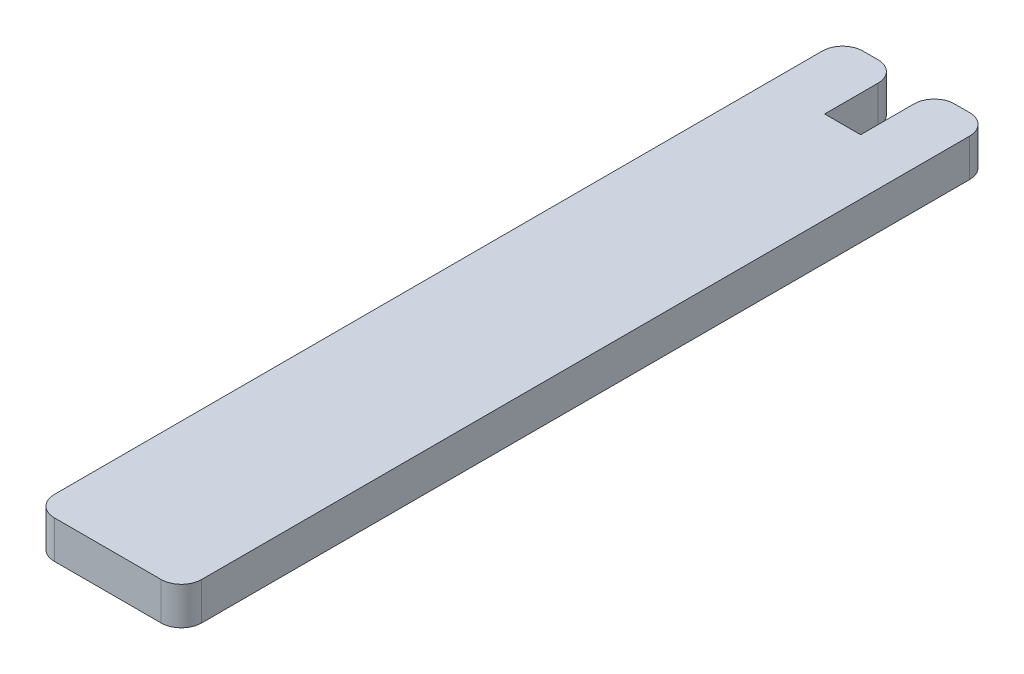
ISO-10303-21;
HEADER;
FILE_DESCRIPTION(('STEP AP214'),'2;1');
FILE_NAME('part.step','',(''),(''),'','','');
FILE_SCHEMA(('AUTOMOTIVE_DESIGN { 1 0 10303 214 1 1 1 1 }'));
ENDSEC;
DATA;
#1=APPLICATION_CONTEXT('core data for automotive mechanical design processes');
#2=APPLICATION_PROTOCOL_DEFINITION('international standard','automotive_design',2000,#1);
#3=PRODUCT_CONTEXT('',#1,'mechanical');
#4=PRODUCT('Part','Part','',(#3));
#5=PRODUCT_RELATED_PRODUCT_CATEGORY('part','',(#4));
#6=PRODUCT_DEFINITION_FORMATION('','',#4);
#7=PRODUCT_DEFINITION_CONTEXT('part definition',#1,'design');
#8=PRODUCT_DEFINITION('design','',#6,#7);
#9=PRODUCT_DEFINITION_SHAPE('','',#8);
#10=(LENGTH_UNIT() NAMED_UNIT(*) SI_UNIT(.MILLI.,.METRE.));
#11=(NAMED_UNIT(*) PLANE_ANGLE_UNIT() SI_UNIT($,.RADIAN.));
#12=(NAMED_UNIT(*) SI_UNIT($,.STERADIAN.) SOLID_ANGLE_UNIT());
#13=UNCERTAINTY_MEASURE_WITH_UNIT(LENGTH_MEASURE(1.E-05),#10,'distance_accuracy_value','');
#14=(GEOMETRIC_REPRESENTATION_CONTEXT(3) GLOBAL_UNCERTAINTY_ASSIGNED_CONTEXT((#13)) GLOBAL_UNIT_ASSIGNED_CONTEXT((#10,
#11,#12)) REPRESENTATION_CONTEXT('',''));
#15=CARTESIAN_POINT('',(0.,0.,0.));
#16=DIRECTION('',(0.,0.,1.));
#17=DIRECTION('',(1.,0.,0.));
#18=AXIS2_PLACEMENT_3D('',#15,#16,#17);
#19=CARTESIAN_POINT('',(12.7,6.5,-69.7));
#20=DIRECTION('',(-1.,0.,0.));
#21=DIRECTION('',(0.,0.,1.));
#22=AXIS2_PLACEMENT_3D('',#19,#20,#21);
#23=PLANE('',#22);
#24=DIRECTION('',(0.,0.,-1.));
#25=VECTOR('',#24,1.);
#26=CARTESIAN_POINT('',(12.7,6.5,-69.7));
#27=LINE('',#26,#25);
#28=CARTESIAN_POINT('',(12.7,6.5,66.2));
#29=VERTEX_POINT('',#28);
#30=CARTESIAN_POINT('',(12.7,6.5,-66.2));
#31=VERTEX_POINT('',#30);
#32=EDGE_CURVE('E193',#29,#31,#27,.T.);
#33=ORIENTED_EDGE('',*,*,#32,.F.);
#34=DIRECTION('',(0.,-1.,0.));
#35=VECTOR('',#34,1.);
#36=CARTESIAN_POINT('',(12.7,6.5,66.2));
#37=LINE('',#36,#35);
#38=CARTESIAN_POINT('',(12.7,0.,66.2));
#39=VERTEX_POINT('',#38);
#40=EDGE_CURVE('E196',#29,#39,#37,.T.);
#41=ORIENTED_EDGE('',*,*,#40,.T.);
#42=DIRECTION('',(0.,0.,-1.));
#43=VECTOR('',#42,1.);
#44=CARTESIAN_POINT('',(12.7,0.,-69.7));
#45=LINE('',#44,#43);
#46=CARTESIAN_POINT('',(12.7,0.,-66.2));
#47=VERTEX_POINT('',#46);
#48=EDGE_CURVE('E173',#39,#47,#45,.T.);
#49=ORIENTED_EDGE('',*,*,#48,.T.);
#50=DIRECTION('',(0.,-1.,0.));
#51=VECTOR('',#50,1.);
#52=CARTESIAN_POINT('',(12.7,6.5,-66.2));
#53=LINE('',#52,#51);
#54=EDGE_CURVE('E156',#47,#31,#53,.F.);
#55=ORIENTED_EDGE('',*,*,#54,.T.);
#56=EDGE_LOOP('',(#33,#41,#49,#55));
#57=FACE_BOUND('',#56,.T.);
#58=ADVANCED_FACE('F33',(#57),#23,.F.);
#59=CARTESIAN_POINT('',(3.1,6.5,-69.7));
#60=DIRECTION('',(0.,0.,1.));
#61=DIRECTION('',(1.,0.,0.));
#62=AXIS2_PLACEMENT_3D('',#59,#60,#61);
#63=PLANE('',#62);
#64=DIRECTION('',(-1.,0.,0.));
#65=VECTOR('',#64,1.);
#66=CARTESIAN_POINT('',(3.1,0.,-69.7));
#67=LINE('',#66,#65);
#68=CARTESIAN_POINT('',(9.19999999999999,0.,-69.7));
#69=VERTEX_POINT('',#68);
#70=CARTESIAN_POINT('',(6.6,0.,-69.7));
#71=VERTEX_POINT('',#70);
#72=EDGE_CURVE('E176',#69,#71,#67,.T.);
#73=ORIENTED_EDGE('',*,*,#72,.T.);
#74=DIRECTION('',(0.,-1.,0.));
#75=VECTOR('',#74,1.);
#76=CARTESIAN_POINT('',(6.6,6.5,-69.7));
#77=LINE('',#76,#75);
#78=CARTESIAN_POINT('',(6.6,6.5,-69.7));
#79=VERTEX_POINT('',#78);
#80=EDGE_CURVE('E235',#71,#79,#77,.F.);
#81=ORIENTED_EDGE('',*,*,#80,.T.);
#82=DIRECTION('',(-1.,0.,0.));
#83=VECTOR('',#82,1.);
#84=CARTESIAN_POINT('',(3.1,6.5,-69.7));
#85=LINE('',#84,#83);
#86=CARTESIAN_POINT('',(9.19999999999999,6.5,-69.7));
#87=VERTEX_POINT('',#86);
#88=EDGE_CURVE('E147',#87,#79,#85,.T.);
#89=ORIENTED_EDGE('',*,*,#88,.F.);
#90=DIRECTION('',(0.,-1.,0.));
#91=VECTOR('',#90,1.);
#92=CARTESIAN_POINT('',(9.19999999999999,6.5,-69.7));
#93=LINE('',#92,#91);
#94=EDGE_CURVE('E232',#87,#69,#93,.T.);
#95=ORIENTED_EDGE('',*,*,#94,.T.);
#96=EDGE_LOOP('',(#73,#81,#89,#95));
#97=FACE_BOUND('',#96,.T.);
#98=ADVANCED_FACE('F294',(#97),#63,.F.);
#99=CARTESIAN_POINT('',(3.1,6.5,-69.7));
#100=DIRECTION('',(1.,0.,0.));
#101=DIRECTION('',(0.,0.,-1.));
#102=AXIS2_PLACEMENT_3D('',#99,#100,#101);
#103=PLANE('',#102);
#104=DIRECTION('',(0.,0.,1.));
#105=VECTOR('',#104,1.);
#106=CARTESIAN_POINT('',(3.1,6.5,-69.7));
#107=LINE('',#106,#105);
#108=CARTESIAN_POINT('',(3.1,6.5,-66.2));
#109=VERTEX_POINT('',#108);
#110=CARTESIAN_POINT('',(3.1,6.5,-57.));
#111=VERTEX_POINT('',#110);
#112=EDGE_CURVE('E133',#109,#111,#107,.T.);
#113=ORIENTED_EDGE('',*,*,#112,.F.);
#114=DIRECTION('',(0.,-1.,0.));
#115=VECTOR('',#114,1.);
#116=CARTESIAN_POINT('',(3.1,6.5,-66.2));
#117=LINE('',#116,#115);
#118=CARTESIAN_POINT('',(3.1,0.,-66.2));
#119=VERTEX_POINT('',#118);
#120=EDGE_CURVE('E230',#109,#119,#117,.T.);
#121=ORIENTED_EDGE('',*,*,#120,.T.);
#122=DIRECTION('',(0.,0.,1.));
#123=VECTOR('',#122,1.);
#124=CARTESIAN_POINT('',(3.1,0.,-69.7));
#125=LINE('',#124,#123);
#126=CARTESIAN_POINT('',(3.1,0.,-57.));
#127=VERTEX_POINT('',#126);
#128=EDGE_CURVE('E153',#119,#127,#125,.T.);
#129=ORIENTED_EDGE('',*,*,#128,.T.);
#130=DIRECTION('',(0.,-1.,0.));
#131=VECTOR('',#130,1.);
#132=CARTESIAN_POINT('',(3.1,6.5,-57.));
#133=LINE('',#132,#131);
#134=EDGE_CURVE('E150',#111,#127,#133,.T.);
#135=ORIENTED_EDGE('',*,*,#134,.F.);
#136=EDGE_LOOP('',(#113,#121,#129,#135));
#137=FACE_BOUND('',#136,.T.);
#138=ADVANCED_FACE('F151',(#137),#103,.F.);
#139=CARTESIAN_POINT('',(-3.1,6.5,-57.));
#140=DIRECTION('',(0.,0.,1.));
#141=DIRECTION('',(1.,0.,0.));
#142=AXIS2_PLACEMENT_3D('',#139,#140,#141);
#143=PLANE('',#142);
#144=DIRECTION('',(-1.,0.,0.));
#145=VECTOR('',#144,1.);
#146=CARTESIAN_POINT('',(-3.1,0.,-57.));
#147=LINE('',#146,#145);
#148=CARTESIAN_POINT('',(-3.1,0.,-57.));
#149=VERTEX_POINT('',#148);
#150=EDGE_CURVE('E180',#127,#149,#147,.T.);
#151=ORIENTED_EDGE('',*,*,#150,.T.);
#152=DIRECTION('',(0.,-1.,0.));
#153=VECTOR('',#152,1.);
#154=CARTESIAN_POINT('',(-3.1,6.5,-57.));
#155=LINE('',#154,#153);
#156=CARTESIAN_POINT('',(-3.1,6.5,-57.));
#157=VERTEX_POINT('',#156);
#158=EDGE_CURVE('E157',#157,#149,#155,.T.);
#159=ORIENTED_EDGE('',*,*,#158,.F.);
#160=DIRECTION('',(-1.,0.,0.));
#161=VECTOR('',#160,1.);
#162=CARTESIAN_POINT('',(-3.1,6.5,-57.));
#163=LINE('',#162,#161);
#164=EDGE_CURVE('E139',#111,#157,#163,.T.);
#165=ORIENTED_EDGE('',*,*,#164,.F.);
#166=ORIENTED_EDGE('',*,*,#134,.T.);
#167=EDGE_LOOP('',(#151,#159,#165,#166));
#168=FACE_BOUND('',#167,.T.);
#169=ADVANCED_FACE('F159',(#168),#143,.F.);
#170=CARTESIAN_POINT('',(-3.1,6.5,-69.7));
#171=DIRECTION('',(-1.,0.,0.));
#172=DIRECTION('',(0.,0.,1.));
#173=AXIS2_PLACEMENT_3D('',#170,#171,#172);
#174=PLANE('',#173);
#175=DIRECTION('',(0.,0.,-1.));
#176=VECTOR('',#175,1.);
#177=CARTESIAN_POINT('',(-3.1,0.,-69.7));
#178=LINE('',#177,#176);
#179=CARTESIAN_POINT('',(-3.1,0.,-66.2));
#180=VERTEX_POINT('',#179);
#181=EDGE_CURVE('E182',#149,#180,#178,.T.);
#182=ORIENTED_EDGE('',*,*,#181,.T.);
#183=DIRECTION('',(0.,-1.,0.));
#184=VECTOR('',#183,1.);
#185=CARTESIAN_POINT('',(-3.1,6.5,-66.2));
#186=LINE('',#185,#184);
#187=CARTESIAN_POINT('',(-3.1,6.5,-66.2));
#188=VERTEX_POINT('',#187);
#189=EDGE_CURVE('E11',#180,#188,#186,.F.);
#190=ORIENTED_EDGE('',*,*,#189,.T.);
#191=DIRECTION('',(0.,0.,-1.));
#192=VECTOR('',#191,1.);
#193=CARTESIAN_POINT('',(-3.1,6.5,-69.7));
#194=LINE('',#193,#192);
#195=EDGE_CURVE('E162',#157,#188,#194,.T.);
#196=ORIENTED_EDGE('',*,*,#195,.F.);
#197=ORIENTED_EDGE('',*,*,#158,.T.);
#198=EDGE_LOOP('',(#182,#190,#196,#197));
#199=FACE_BOUND('',#198,.T.);
#200=ADVANCED_FACE('F283',(#199),#174,.F.);
#201=CARTESIAN_POINT('',(-12.7,6.5,-69.7));
#202=DIRECTION('',(0.,0.,1.));
#203=DIRECTION('',(1.,0.,0.));
#204=AXIS2_PLACEMENT_3D('',#201,#202,#203);
#205=PLANE('',#204);
#206=DIRECTION('',(-1.,0.,0.));
#207=VECTOR('',#206,1.);
#208=CARTESIAN_POINT('',(-12.7,6.5,-69.7));
#209=LINE('',#208,#207);
#210=CARTESIAN_POINT('',(-6.6,6.5,-69.7));
#211=VERTEX_POINT('',#210);
#212=CARTESIAN_POINT('',(-9.20000000000001,6.5,-69.7));
#213=VERTEX_POINT('',#212);
#214=EDGE_CURVE('E164',#211,#213,#209,.T.);
#215=ORIENTED_EDGE('',*,*,#214,.F.);
#216=DIRECTION('',(0.,-1.,0.));
#217=VECTOR('',#216,1.);
#218=CARTESIAN_POINT('',(-6.6,6.5,-69.7));
#219=LINE('',#218,#217);
#220=CARTESIAN_POINT('',(-6.6,0.,-69.7));
#221=VERTEX_POINT('',#220);
#222=EDGE_CURVE('E41',#211,#221,#219,.T.);
#223=ORIENTED_EDGE('',*,*,#222,.T.);
#224=DIRECTION('',(-1.,0.,0.));
#225=VECTOR('',#224,1.);
#226=CARTESIAN_POINT('',(-12.7,0.,-69.7));
#227=LINE('',#226,#225);
#228=CARTESIAN_POINT('',(-9.20000000000001,0.,-69.7));
#229=VERTEX_POINT('',#228);
#230=EDGE_CURVE('E185',#221,#229,#227,.T.);
#231=ORIENTED_EDGE('',*,*,#230,.T.);
#232=DIRECTION('',(0.,-1.,0.));
#233=VECTOR('',#232,1.);
#234=CARTESIAN_POINT('',(-9.20000000000001,6.5,-69.7));
#235=LINE('',#234,#233);
#236=EDGE_CURVE('E237',#229,#213,#235,.F.);
#237=ORIENTED_EDGE('',*,*,#236,.T.);
#238=EDGE_LOOP('',(#215,#223,#231,#237));
#239=FACE_BOUND('',#238,.T.);
#240=ADVANCED_FACE('F243',(#239),#205,.F.);
#241=CARTESIAN_POINT('',(-12.7,6.5,-69.7));
#242=DIRECTION('',(1.,0.,0.));
#243=DIRECTION('',(0.,0.,-1.));
#244=AXIS2_PLACEMENT_3D('',#241,#242,#243);
#245=PLANE('',#244);
#246=DIRECTION('',(0.,0.,1.));
#247=VECTOR('',#246,1.);
#248=CARTESIAN_POINT('',(-12.7,0.,-69.7));
#249=LINE('',#248,#247);
#250=CARTESIAN_POINT('',(-12.7,0.,-66.2));
#251=VERTEX_POINT('',#250);
#252=CARTESIAN_POINT('',(-12.7,0.,66.2));
#253=VERTEX_POINT('',#252);
#254=EDGE_CURVE('E188',#251,#253,#249,.T.);
#255=ORIENTED_EDGE('',*,*,#254,.T.);
#256=DIRECTION('',(0.,-1.,0.));
#257=VECTOR('',#256,1.);
#258=CARTESIAN_POINT('',(-12.7,6.5,66.2));
#259=LINE('',#258,#257);
#260=CARTESIAN_POINT('',(-12.7,6.5,66.2));
#261=VERTEX_POINT('',#260);
#262=EDGE_CURVE('E48',#253,#261,#259,.F.);
#263=ORIENTED_EDGE('',*,*,#262,.T.);
#264=DIRECTION('',(0.,0.,1.));
#265=VECTOR('',#264,1.);
#266=CARTESIAN_POINT('',(-12.7,6.5,-69.7));
#267=LINE('',#266,#265);
#268=CARTESIAN_POINT('',(-12.7,6.5,-66.2));
#269=VERTEX_POINT('',#268);
#270=EDGE_CURVE('E169',#269,#261,#267,.T.);
#271=ORIENTED_EDGE('',*,*,#270,.F.);
#272=DIRECTION('',(0.,-1.,0.));
#273=VECTOR('',#272,1.);
#274=CARTESIAN_POINT('',(-12.7,6.5,-66.2));
#275=LINE('',#274,#273);
#276=EDGE_CURVE('E226',#269,#251,#275,.T.);
#277=ORIENTED_EDGE('',*,*,#276,.T.);
#278=EDGE_LOOP('',(#255,#263,#271,#277));
#279=FACE_BOUND('',#278,.T.);
#280=ADVANCED_FACE('F255',(#279),#245,.F.);
#281=CARTESIAN_POINT('',(-12.7,6.5,69.7));
#282=DIRECTION('',(0.,0.,-1.));
#283=DIRECTION('',(-1.,0.,0.));
#284=AXIS2_PLACEMENT_3D('',#281,#282,#283);
#285=PLANE('',#284);
#286=DIRECTION('',(1.,0.,0.));
#287=VECTOR('',#286,1.);
#288=CARTESIAN_POINT('',(-12.7,0.,69.7));
#289=LINE('',#288,#287);
#290=CARTESIAN_POINT('',(-9.19999999999999,0.,69.7));
#291=VERTEX_POINT('',#290);
#292=CARTESIAN_POINT('',(9.2,0.,69.7));
#293=VERTEX_POINT('',#292);
#294=EDGE_CURVE('E190',#291,#293,#289,.T.);
#295=ORIENTED_EDGE('',*,*,#294,.T.);
#296=DIRECTION('',(0.,-1.,0.));
#297=VECTOR('',#296,1.);
#298=CARTESIAN_POINT('',(9.20000000000001,6.5,69.7));
#299=LINE('',#298,#297);
#300=CARTESIAN_POINT('',(9.2,6.5,69.7));
#301=VERTEX_POINT('',#300);
#302=EDGE_CURVE('E214',#293,#301,#299,.F.);
#303=ORIENTED_EDGE('',*,*,#302,.T.);
#304=DIRECTION('',(1.,0.,0.));
#305=VECTOR('',#304,1.);
#306=CARTESIAN_POINT('',(-12.7,6.5,69.7));
#307=LINE('',#306,#305);
#308=CARTESIAN_POINT('',(-9.19999999999999,6.5,69.7));
#309=VERTEX_POINT('',#308);
#310=EDGE_CURVE('E171',#309,#301,#307,.T.);
#311=ORIENTED_EDGE('',*,*,#310,.F.);
#312=DIRECTION('',(0.,-1.,0.));
#313=VECTOR('',#312,1.);
#314=CARTESIAN_POINT('',(-9.19999999999999,6.5,69.7));
#315=LINE('',#314,#313);
#316=EDGE_CURVE('E211',#309,#291,#315,.T.);
#317=ORIENTED_EDGE('',*,*,#316,.T.);
#318=EDGE_LOOP('',(#295,#303,#311,#317));
#319=FACE_BOUND('',#318,.T.);
#320=ADVANCED_FACE('F263',(#319),#285,.F.);
#321=CARTESIAN_POINT('',(0.,6.5,0.));
#322=DIRECTION('',(0.,1.,0.));
#323=DIRECTION('',(0.,0.,1.));
#324=AXIS2_PLACEMENT_3D('',#321,#322,#323);
#325=PLANE('',#324);
#326=ORIENTED_EDGE('',*,*,#310,.T.);
#327=CARTESIAN_POINT('',(9.20000000000001,6.5,66.2));
#328=DIRECTION('',(0.,1.,0.));
#329=DIRECTION('',(0.,0.,1.));
#330=AXIS2_PLACEMENT_3D('',#327,#328,#329);
#331=CIRCLE('',#330,3.5);
#332=EDGE_CURVE('E224',#301,#29,#331,.T.);
#333=ORIENTED_EDGE('',*,*,#332,.T.);
#334=ORIENTED_EDGE('',*,*,#32,.T.);
#335=CARTESIAN_POINT('',(9.19999999999999,6.5,-66.2));
#336=DIRECTION('',(0.,1.,0.));
#337=DIRECTION('',(0.,0.,1.));
#338=AXIS2_PLACEMENT_3D('',#335,#336,#337);
#339=CIRCLE('',#338,3.5);
#340=EDGE_CURVE('E216',#31,#87,#339,.T.);
#341=ORIENTED_EDGE('',*,*,#340,.T.);
#342=ORIENTED_EDGE('',*,*,#88,.T.);
#343=CARTESIAN_POINT('',(6.6,6.5,-66.2));
#344=DIRECTION('',(0.,1.,0.));
#345=DIRECTION('',(0.,0.,1.));
#346=AXIS2_PLACEMENT_3D('',#343,#344,#345);
#347=CIRCLE('',#346,3.5);
#348=EDGE_CURVE('E143',#79,#109,#347,.T.);
#349=ORIENTED_EDGE('',*,*,#348,.T.);
#350=ORIENTED_EDGE('',*,*,#112,.T.);
#351=ORIENTED_EDGE('',*,*,#164,.T.);
#352=ORIENTED_EDGE('',*,*,#195,.T.);
#353=CARTESIAN_POINT('',(-6.6,6.5,-66.2));
#354=DIRECTION('',(0.,1.,0.));
#355=DIRECTION('',(0.,0.,1.));
#356=AXIS2_PLACEMENT_3D('',#353,#354,#355);
#357=CIRCLE('',#356,3.5);
#358=EDGE_CURVE('E219',#188,#211,#357,.T.);
#359=ORIENTED_EDGE('',*,*,#358,.T.);
#360=ORIENTED_EDGE('',*,*,#214,.T.);
#361=CARTESIAN_POINT('',(-9.20000000000001,6.5,-66.2));
#362=DIRECTION('',(0.,1.,0.));
#363=DIRECTION('',(0.,0.,1.));
#364=AXIS2_PLACEMENT_3D('',#361,#362,#363);
#365=CIRCLE('',#364,3.5);
#366=EDGE_CURVE('E55',#213,#269,#365,.T.);
#367=ORIENTED_EDGE('',*,*,#366,.T.);
#368=ORIENTED_EDGE('',*,*,#270,.T.);
#369=CARTESIAN_POINT('',(-9.19999999999999,6.5,66.2));
#370=DIRECTION('',(0.,1.,0.));
#371=DIRECTION('',(0.,0.,1.));
#372=AXIS2_PLACEMENT_3D('',#369,#370,#371);
#373=CIRCLE('',#372,3.5);
#374=EDGE_CURVE('E222',#261,#309,#373,.T.);
#375=ORIENTED_EDGE('',*,*,#374,.T.);
#376=EDGE_LOOP('',(#326,#333,#334,#341,#342,#349,#350,#351,#352,#359,#360,#367,#368,#375));
#377=FACE_BOUND('',#376,.T.);
#378=ADVANCED_FACE('F136',(#377),#325,.T.);
#379=CARTESIAN_POINT('',(0.,0.,0.));
#380=DIRECTION('',(0.,1.,0.));
#381=DIRECTION('',(0.,0.,1.));
#382=AXIS2_PLACEMENT_3D('',#379,#380,#381);
#383=PLANE('',#382);
#384=ORIENTED_EDGE('',*,*,#48,.F.);
#385=CARTESIAN_POINT('',(9.20000000000001,0.,66.2));
#386=DIRECTION('',(0.,1.,0.));
#387=DIRECTION('',(0.,0.,1.));
#388=AXIS2_PLACEMENT_3D('',#385,#386,#387);
#389=CIRCLE('',#388,3.5);
#390=EDGE_CURVE('E209',#39,#293,#389,.F.);
#391=ORIENTED_EDGE('',*,*,#390,.T.);
#392=ORIENTED_EDGE('',*,*,#294,.F.);
#393=CARTESIAN_POINT('',(-9.19999999999999,0.,66.2));
#394=DIRECTION('',(0.,1.,0.));
#395=DIRECTION('',(0.,0.,1.));
#396=AXIS2_PLACEMENT_3D('',#393,#394,#395);
#397=CIRCLE('',#396,3.5);
#398=EDGE_CURVE('E207',#291,#253,#397,.F.);
#399=ORIENTED_EDGE('',*,*,#398,.T.);
#400=ORIENTED_EDGE('',*,*,#254,.F.);
#401=CARTESIAN_POINT('',(-9.20000000000001,0.,-66.2));
#402=DIRECTION('',(0.,1.,0.));
#403=DIRECTION('',(0.,0.,1.));
#404=AXIS2_PLACEMENT_3D('',#401,#402,#403);
#405=CIRCLE('',#404,3.5);
#406=EDGE_CURVE('E201',#251,#229,#405,.F.);
#407=ORIENTED_EDGE('',*,*,#406,.T.);
#408=ORIENTED_EDGE('',*,*,#230,.F.);
#409=CARTESIAN_POINT('',(-6.6,0.,-66.2));
#410=DIRECTION('',(0.,1.,0.));
#411=DIRECTION('',(0.,0.,1.));
#412=AXIS2_PLACEMENT_3D('',#409,#410,#411);
#413=CIRCLE('',#412,3.5);
#414=EDGE_CURVE('E203',#221,#180,#413,.F.);
#415=ORIENTED_EDGE('',*,*,#414,.T.);
#416=ORIENTED_EDGE('',*,*,#181,.F.);
#417=ORIENTED_EDGE('',*,*,#150,.F.);
#418=ORIENTED_EDGE('',*,*,#128,.F.);
#419=CARTESIAN_POINT('',(6.6,0.,-66.2));
#420=DIRECTION('',(0.,1.,0.));
#421=DIRECTION('',(0.,0.,1.));
#422=AXIS2_PLACEMENT_3D('',#419,#420,#421);
#423=CIRCLE('',#422,3.5);
#424=EDGE_CURVE('E205',#119,#71,#423,.F.);
#425=ORIENTED_EDGE('',*,*,#424,.T.);
#426=ORIENTED_EDGE('',*,*,#72,.F.);
#427=CARTESIAN_POINT('',(9.19999999999999,0.,-66.2));
#428=DIRECTION('',(0.,1.,0.));
#429=DIRECTION('',(0.,0.,1.));
#430=AXIS2_PLACEMENT_3D('',#427,#428,#429);
#431=CIRCLE('',#430,3.5);
#432=EDGE_CURVE('E199',#69,#47,#431,.F.);
#433=ORIENTED_EDGE('',*,*,#432,.T.);
#434=EDGE_LOOP('',(#384,#391,#392,#399,#400,#407,#408,#415,#416,#417,#418,#425,#426,#433));
#435=FACE_BOUND('',#434,.T.);
#436=ADVANCED_FACE('F249',(#435),#383,.F.);
#437=CARTESIAN_POINT('',(9.20000000000001,6.5,66.2));
#438=DIRECTION('',(0.,-1.,0.));
#439=DIRECTION('',(0.,0.,-1.));
#440=AXIS2_PLACEMENT_3D('',#437,#438,#439);
#441=CYLINDRICAL_SURFACE('',#440,3.5);
#442=ORIENTED_EDGE('',*,*,#332,.F.);
#443=ORIENTED_EDGE('',*,*,#302,.F.);
#444=ORIENTED_EDGE('',*,*,#390,.F.);
#445=ORIENTED_EDGE('',*,*,#40,.F.);
#446=EDGE_LOOP('',(#442,#443,#444,#445));
#447=FACE_BOUND('',#446,.T.);
#448=ADVANCED_FACE('F268',(#447),#441,.T.);
#449=CARTESIAN_POINT('',(-9.19999999999999,6.5,66.2));
#450=DIRECTION('',(0.,-1.,0.));
#451=DIRECTION('',(0.,0.,-1.));
#452=AXIS2_PLACEMENT_3D('',#449,#450,#451);
#453=CYLINDRICAL_SURFACE('',#452,3.5);
#454=ORIENTED_EDGE('',*,*,#374,.F.);
#455=ORIENTED_EDGE('',*,*,#262,.F.);
#456=ORIENTED_EDGE('',*,*,#398,.F.);
#457=ORIENTED_EDGE('',*,*,#316,.F.);
#458=EDGE_LOOP('',(#454,#455,#456,#457));
#459=FACE_BOUND('',#458,.T.);
#460=ADVANCED_FACE('F260',(#459),#453,.T.);
#461=CARTESIAN_POINT('',(6.6,6.5,-66.2));
#462=DIRECTION('',(0.,-1.,0.));
#463=DIRECTION('',(0.,0.,-1.));
#464=AXIS2_PLACEMENT_3D('',#461,#462,#463);
#465=CYLINDRICAL_SURFACE('',#464,3.5);
#466=ORIENTED_EDGE('',*,*,#348,.F.);
#467=ORIENTED_EDGE('',*,*,#80,.F.);
#468=ORIENTED_EDGE('',*,*,#424,.F.);
#469=ORIENTED_EDGE('',*,*,#120,.F.);
#470=EDGE_LOOP('',(#466,#467,#468,#469));
#471=FACE_BOUND('',#470,.T.);
#472=ADVANCED_FACE('F280',(#471),#465,.T.);
#473=CARTESIAN_POINT('',(-6.6,6.5,-66.2));
#474=DIRECTION('',(0.,-1.,0.));
#475=DIRECTION('',(0.,0.,-1.));
#476=AXIS2_PLACEMENT_3D('',#473,#474,#475);
#477=CYLINDRICAL_SURFACE('',#476,3.5);
#478=ORIENTED_EDGE('',*,*,#358,.F.);
#479=ORIENTED_EDGE('',*,*,#189,.F.);
#480=ORIENTED_EDGE('',*,*,#414,.F.);
#481=ORIENTED_EDGE('',*,*,#222,.F.);
#482=EDGE_LOOP('',(#478,#479,#480,#481));
#483=FACE_BOUND('',#482,.T.);
#484=ADVANCED_FACE('F285',(#483),#477,.T.);
#485=CARTESIAN_POINT('',(-9.20000000000001,6.5,-66.2));
#486=DIRECTION('',(0.,-1.,0.));
#487=DIRECTION('',(0.,0.,-1.));
#488=AXIS2_PLACEMENT_3D('',#485,#486,#487);
#489=CYLINDRICAL_SURFACE('',#488,3.5);
#490=ORIENTED_EDGE('',*,*,#366,.F.);
#491=ORIENTED_EDGE('',*,*,#236,.F.);
#492=ORIENTED_EDGE('',*,*,#406,.F.);
#493=ORIENTED_EDGE('',*,*,#276,.F.);
#494=EDGE_LOOP('',(#490,#491,#492,#493));
#495=FACE_BOUND('',#494,.T.);
#496=ADVANCED_FACE('F254',(#495),#489,.T.);
#497=CARTESIAN_POINT('',(9.19999999999999,6.5,-66.2));
#498=DIRECTION('',(0.,-1.,0.));
#499=DIRECTION('',(0.,0.,-1.));
#500=AXIS2_PLACEMENT_3D('',#497,#498,#499);
#501=CYLINDRICAL_SURFACE('',#500,3.5);
#502=ORIENTED_EDGE('',*,*,#340,.F.);
#503=ORIENTED_EDGE('',*,*,#54,.F.);
#504=ORIENTED_EDGE('',*,*,#432,.F.);
#505=ORIENTED_EDGE('',*,*,#94,.F.);
#506=EDGE_LOOP('',(#502,#503,#504,#505));
#507=FACE_BOUND('',#506,.T.);
#508=ADVANCED_FACE('F35',(#507),#501,.T.);
#509=CLOSED_SHELL('',(#58,#98,#138,#169,#200,#240,#280,#320,#378,#436,#448,#460,#472,#484,#496,#508));
#510=MANIFOLD_SOLID_BREP('B2',#509);
#511=ADVANCED_BREP_SHAPE_REPRESENTATION('',(#18,#510),#14);
#512=SHAPE_DEFINITION_REPRESENTATION(#9,#511);
ENDSEC;
END-ISO-10303-21;
